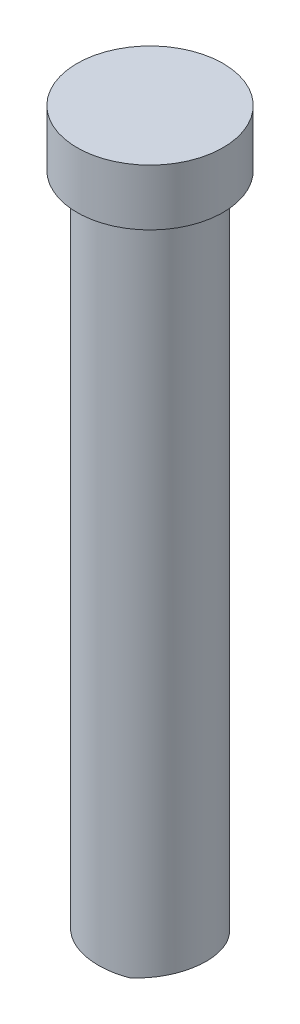
ISO-10303-21;
HEADER;
FILE_DESCRIPTION(('STEP AP214'),'2;1');
FILE_NAME('part.step','',(''),(''),'','','');
FILE_SCHEMA(('AUTOMOTIVE_DESIGN { 1 0 10303 214 1 1 1 1 }'));
ENDSEC;
DATA;
#1=APPLICATION_CONTEXT('core data for automotive mechanical design processes');
#2=APPLICATION_PROTOCOL_DEFINITION('international standard','automotive_design',2000,#1);
#3=PRODUCT_CONTEXT('',#1,'mechanical');
#4=PRODUCT('Part','Part','',(#3));
#5=PRODUCT_RELATED_PRODUCT_CATEGORY('part','',(#4));
#6=PRODUCT_DEFINITION_FORMATION('','',#4);
#7=PRODUCT_DEFINITION_CONTEXT('part definition',#1,'design');
#8=PRODUCT_DEFINITION('design','',#6,#7);
#9=PRODUCT_DEFINITION_SHAPE('','',#8);
#10=(LENGTH_UNIT() NAMED_UNIT(*) SI_UNIT(.MILLI.,.METRE.));
#11=(NAMED_UNIT(*) PLANE_ANGLE_UNIT() SI_UNIT($,.RADIAN.));
#12=(NAMED_UNIT(*) SI_UNIT($,.STERADIAN.) SOLID_ANGLE_UNIT());
#13=UNCERTAINTY_MEASURE_WITH_UNIT(LENGTH_MEASURE(1.E-05),#10,'distance_accuracy_value','');
#14=(GEOMETRIC_REPRESENTATION_CONTEXT(3) GLOBAL_UNCERTAINTY_ASSIGNED_CONTEXT((#13)) GLOBAL_UNIT_ASSIGNED_CONTEXT((#10,
#11,#12)) REPRESENTATION_CONTEXT('',''));
#15=CARTESIAN_POINT('',(0.,0.,0.));
#16=DIRECTION('',(0.,0.,1.));
#17=DIRECTION('',(1.,0.,0.));
#18=AXIS2_PLACEMENT_3D('',#15,#16,#17);
#19=CARTESIAN_POINT('',(0.,0.,0.));
#20=DIRECTION('',(0.,1.,0.));
#21=DIRECTION('',(0.,0.,1.));
#22=AXIS2_PLACEMENT_3D('',#19,#20,#21);
#23=PLANE('',#22);
#24=CARTESIAN_POINT('',(0.,0.,0.));
#25=DIRECTION('',(0.,-1.,0.));
#26=DIRECTION('',(0.,0.,-1.));
#27=AXIS2_PLACEMENT_3D('',#24,#25,#26);
#28=CIRCLE('',#27,6.5);
#29=CARTESIAN_POINT('',(0.,0.,-6.5));
#30=VERTEX_POINT('',#29);
#31=EDGE_CURVE('E71',#30,#30,#28,.T.);
#32=ORIENTED_EDGE('',*,*,#31,.F.);
#33=EDGE_LOOP('',(#32));
#34=FACE_BOUND('',#33,.T.);
#35=ADVANCED_FACE('F40',(#34),#23,.T.);
#36=CARTESIAN_POINT('',(0.,-69.2,0.));
#37=DIRECTION('',(0.,-1.,0.));
#38=DIRECTION('',(0.,0.,-1.));
#39=AXIS2_PLACEMENT_3D('',#36,#37,#38);
#40=CYLINDRICAL_SURFACE('',#39,6.5);
#41=ORIENTED_EDGE('',*,*,#31,.T.);
#42=EDGE_LOOP('',(#41));
#43=FACE_BOUND('',#42,.T.);
#44=CARTESIAN_POINT('',(0.,-5.,0.));
#45=DIRECTION('',(0.,-1.,0.));
#46=DIRECTION('',(0.,0.,-1.));
#47=AXIS2_PLACEMENT_3D('',#44,#45,#46);
#48=CIRCLE('',#47,6.5);
#49=CARTESIAN_POINT('',(0.,-5.,-6.5));
#50=VERTEX_POINT('',#49);
#51=EDGE_CURVE('E80',#50,#50,#48,.T.);
#52=ORIENTED_EDGE('',*,*,#51,.F.);
#53=EDGE_LOOP('',(#52));
#54=FACE_BOUND('',#53,.T.);
#55=ADVANCED_FACE('F90',(#43,#54),#40,.T.);
#56=CARTESIAN_POINT('',(6.5,-5.,0.));
#57=DIRECTION('',(0.,-1.,0.));
#58=DIRECTION('',(0.,0.,-1.));
#59=AXIS2_PLACEMENT_3D('',#56,#57,#58);
#60=PLANE('',#59);
#61=ORIENTED_EDGE('',*,*,#51,.T.);
#62=EDGE_LOOP('',(#61));
#63=FACE_BOUND('',#62,.T.);
#64=CARTESIAN_POINT('',(0.,-5.,0.));
#65=DIRECTION('',(0.,-1.,0.));
#66=DIRECTION('',(0.,0.,-1.));
#67=AXIS2_PLACEMENT_3D('',#64,#65,#66);
#68=CIRCLE('',#67,5.);
#69=CARTESIAN_POINT('',(0.,-5.,-5.));
#70=VERTEX_POINT('',#69);
#71=EDGE_CURVE('E77',#70,#70,#68,.T.);
#72=ORIENTED_EDGE('',*,*,#71,.F.);
#73=EDGE_LOOP('',(#72));
#74=FACE_BOUND('',#73,.T.);
#75=ADVANCED_FACE('F97',(#63,#74),#60,.T.);
#76=CARTESIAN_POINT('',(0.,-69.2,0.));
#77=DIRECTION('',(0.,-1.,0.));
#78=DIRECTION('',(0.,0.,-1.));
#79=AXIS2_PLACEMENT_3D('',#76,#77,#78);
#80=CYLINDRICAL_SURFACE('',#79,5.);
#81=CARTESIAN_POINT('',(0.,-64.2,0.));
#82=DIRECTION('',(0.0695865504800301,0.990268068741571,-0.120527440954867));
#83=DIRECTION('',(0.49513403437079,-0.139173100960059,-0.857597304086753));
#84=AXIS2_PLACEMENT_3D('',#81,#82,#83);
#85=ELLIPSE('',#84,5.04913786259309,5.);
#86=CARTESIAN_POINT('',(2.49999999999999,-63.848647913244,4.3301270189222));
#87=VERTEX_POINT('',#86);
#88=CARTESIAN_POINT('',(-5.00000000000001,-63.848647913244,0.));
#89=VERTEX_POINT('',#88);
#90=EDGE_CURVE('E61',#87,#89,#85,.F.);
#91=ORIENTED_EDGE('',*,*,#90,.F.);
#92=CARTESIAN_POINT('',(0.,-64.2,0.));
#93=DIRECTION('',(-0.139173100960059,0.990268068741571,0.));
#94=DIRECTION('',(-0.990268068741571,-0.139173100960059,0.));
#95=AXIS2_PLACEMENT_3D('',#92,#93,#94);
#96=ELLIPSE('',#95,5.04913786259309,5.);
#97=CARTESIAN_POINT('',(2.50000000000002,-63.848647913244,-4.33012701892219));
#98=VERTEX_POINT('',#97);
#99=EDGE_CURVE('E76',#98,#87,#96,.F.);
#100=ORIENTED_EDGE('',*,*,#99,.F.);
#101=CARTESIAN_POINT('',(0.,-64.2,0.));
#102=DIRECTION('',(0.0695865504800285,0.990268068741571,0.120527440954868));
#103=DIRECTION('',(0.495134034370778,-0.139173100960059,0.85759730408676));
#104=AXIS2_PLACEMENT_3D('',#101,#102,#103);
#105=ELLIPSE('',#104,5.04913786259309,5.);
#106=EDGE_CURVE('E54',#89,#98,#105,.F.);
#107=ORIENTED_EDGE('',*,*,#106,.F.);
#108=EDGE_LOOP('',(#91,#100,#107));
#109=FACE_BOUND('',#108,.T.);
#110=ORIENTED_EDGE('',*,*,#71,.T.);
#111=EDGE_LOOP('',(#110));
#112=FACE_BOUND('',#111,.T.);
#113=ADVANCED_FACE('F101',(#109,#112),#80,.T.);
#114=CARTESIAN_POINT('',(0.,-64.2,-6.5));
#115=DIRECTION('',(-0.139173100960059,0.990268068741571,0.));
#116=DIRECTION('',(-0.990268068741571,-0.139173100960059,0.));
#117=AXIS2_PLACEMENT_3D('',#114,#115,#116);
#118=PLANE('',#117);
#119=ORIENTED_EDGE('',*,*,#99,.T.);
#120=DIRECTION('',(-0.498770070223375,-0.0700975619937603,-0.863895102921588));
#121=VECTOR('',#120,1.);
#122=CARTESIAN_POINT('',(-2.8007526374739,-64.5936201134655,-4.85104586753735));
#123=LINE('',#122,#121);
#124=CARTESIAN_POINT('',(0.,-64.2,0.));
#125=VERTEX_POINT('',#124);
#126=EDGE_CURVE('E11',#87,#125,#123,.T.);
#127=ORIENTED_EDGE('',*,*,#126,.T.);
#128=DIRECTION('',(0.498770070223381,0.0700975619937612,-0.863895102921584));
#129=VECTOR('',#128,1.);
#130=CARTESIAN_POINT('',(2.80075263747392,-63.8063798865345,-4.85104586753731));
#131=LINE('',#130,#129);
#132=EDGE_CURVE('E47',#125,#98,#131,.T.);
#133=ORIENTED_EDGE('',*,*,#132,.T.);
#134=EDGE_LOOP('',(#119,#127,#133));
#135=FACE_BOUND('',#134,.T.);
#136=ADVANCED_FACE('F75',(#135),#118,.F.);
#137=CARTESIAN_POINT('',(7.68958256229942,-64.2,4.43958256229947));
#138=DIRECTION('',(0.0695865504800301,0.990268068741571,-0.120527440954867));
#139=DIRECTION('',(0.,0.120820319327159,0.992674392959586));
#140=AXIS2_PLACEMENT_3D('',#137,#138,#139);
#141=PLANE('',#140);
#142=ORIENTED_EDGE('',*,*,#90,.T.);
#143=DIRECTION('',(0.997540140446755,-0.0700975619937603,0.));
#144=VECTOR('',#143,1.);
#145=CARTESIAN_POINT('',(7.65179850501126,-64.7376950744344,0.));
#146=LINE('',#145,#144);
#147=EDGE_CURVE('E68',#89,#125,#146,.T.);
#148=ORIENTED_EDGE('',*,*,#147,.T.);
#149=ORIENTED_EDGE('',*,*,#126,.F.);
#150=EDGE_LOOP('',(#142,#148,#149));
#151=FACE_BOUND('',#150,.T.);
#152=ADVANCED_FACE('F73',(#151),#141,.F.);
#153=CARTESIAN_POINT('',(-7.68958256229945,-64.2,4.43958256229934));
#154=DIRECTION('',(0.0695865504800285,0.990268068741571,0.120527440954868));
#155=DIRECTION('',(0.,-0.12082031932716,0.992674392959586));
#156=AXIS2_PLACEMENT_3D('',#153,#154,#155);
#157=PLANE('',#156);
#158=ORIENTED_EDGE('',*,*,#106,.T.);
#159=ORIENTED_EDGE('',*,*,#132,.F.);
#160=ORIENTED_EDGE('',*,*,#147,.F.);
#161=EDGE_LOOP('',(#158,#159,#160));
#162=FACE_BOUND('',#161,.T.);
#163=ADVANCED_FACE('F67',(#162),#157,.F.);
#164=CLOSED_SHELL('',(#35,#55,#75,#113,#136,#152,#163));
#165=MANIFOLD_SOLID_BREP('B2',#164);
#166=ADVANCED_BREP_SHAPE_REPRESENTATION('',(#18,#165),#14);
#167=SHAPE_DEFINITION_REPRESENTATION(#9,#166);
ENDSEC;
END-ISO-10303-21;
